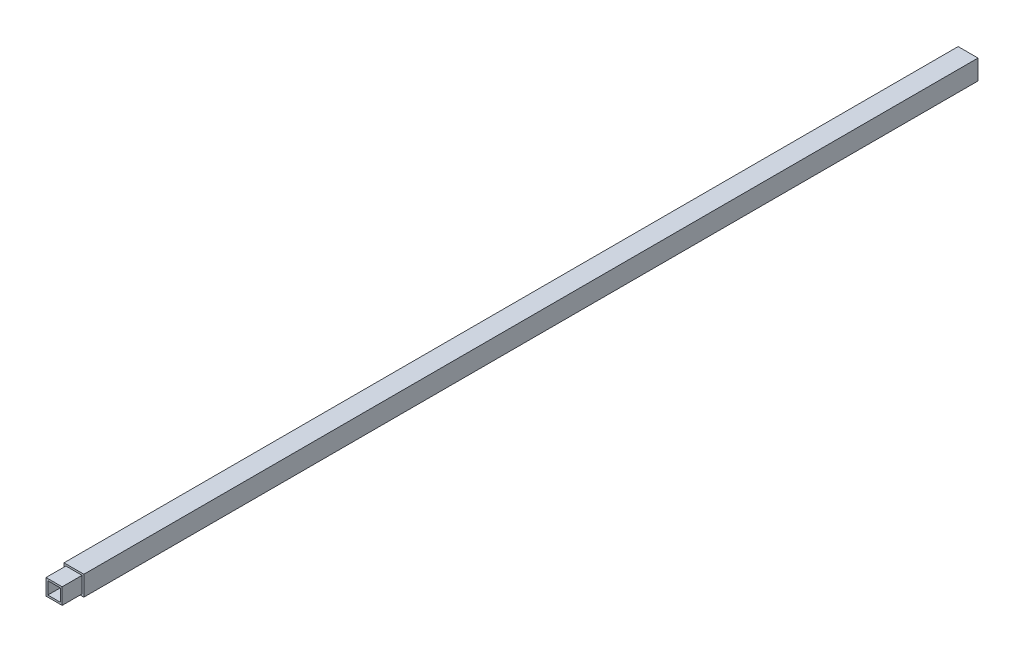
ISO-10303-21;
HEADER;
FILE_DESCRIPTION(('STEP AP214'),'2;1');
FILE_NAME('part.step','',(''),(''),'','','');
FILE_SCHEMA(('AUTOMOTIVE_DESIGN { 1 0 10303 214 1 1 1 1 }'));
ENDSEC;
DATA;
#1=APPLICATION_CONTEXT('core data for automotive mechanical design processes');
#2=APPLICATION_PROTOCOL_DEFINITION('international standard','automotive_design',2000,#1);
#3=PRODUCT_CONTEXT('',#1,'mechanical');
#4=PRODUCT('Part','Part','',(#3));
#5=PRODUCT_RELATED_PRODUCT_CATEGORY('part','',(#4));
#6=PRODUCT_DEFINITION_FORMATION('','',#4);
#7=PRODUCT_DEFINITION_CONTEXT('part definition',#1,'design');
#8=PRODUCT_DEFINITION('design','',#6,#7);
#9=PRODUCT_DEFINITION_SHAPE('','',#8);
#10=(LENGTH_UNIT() NAMED_UNIT(*) SI_UNIT(.MILLI.,.METRE.));
#11=(NAMED_UNIT(*) PLANE_ANGLE_UNIT() SI_UNIT($,.RADIAN.));
#12=(NAMED_UNIT(*) SI_UNIT($,.STERADIAN.) SOLID_ANGLE_UNIT());
#13=UNCERTAINTY_MEASURE_WITH_UNIT(LENGTH_MEASURE(1.E-05),#10,'distance_accuracy_value','');
#14=(GEOMETRIC_REPRESENTATION_CONTEXT(3) GLOBAL_UNCERTAINTY_ASSIGNED_CONTEXT((#13)) GLOBAL_UNIT_ASSIGNED_CONTEXT((#10,
#11,#12)) REPRESENTATION_CONTEXT('',''));
#15=CARTESIAN_POINT('',(0.,0.,0.));
#16=DIRECTION('',(0.,0.,1.));
#17=DIRECTION('',(1.,0.,0.));
#18=AXIS2_PLACEMENT_3D('',#15,#16,#17);
#19=CARTESIAN_POINT('',(0.,4.7625,1143.));
#20=DIRECTION('',(0.,1.,0.));
#21=DIRECTION('',(0.,0.,1.));
#22=AXIS2_PLACEMENT_3D('',#19,#20,#21);
#23=PLANE('',#22);
#24=DIRECTION('',(0.,0.,-1.));
#25=VECTOR('',#24,1.);
#26=CARTESIAN_POINT('',(4.7625,4.7625,1143.));
#27=LINE('',#26,#25);
#28=CARTESIAN_POINT('',(4.7625,4.7625,1092.2));
#29=VERTEX_POINT('',#28);
#30=CARTESIAN_POINT('',(4.7625,4.7625,-1143.));
#31=VERTEX_POINT('',#30);
#32=EDGE_CURVE('E11',#29,#31,#27,.T.);
#33=ORIENTED_EDGE('',*,*,#32,.F.);
#34=DIRECTION('',(1.,0.,0.));
#35=VECTOR('',#34,1.);
#36=CARTESIAN_POINT('',(0.,4.7625,1092.2));
#37=LINE('',#36,#35);
#38=CARTESIAN_POINT('',(46.0374560000001,4.7625,1092.2));
#39=VERTEX_POINT('',#38);
#40=EDGE_CURVE('E203',#29,#39,#37,.T.);
#41=ORIENTED_EDGE('',*,*,#40,.T.);
#42=DIRECTION('',(0.,0.,-1.));
#43=VECTOR('',#42,1.);
#44=CARTESIAN_POINT('',(46.0374560000001,4.7625,1143.));
#45=LINE('',#44,#43);
#46=CARTESIAN_POINT('',(46.0374560000001,4.7625,-1143.));
#47=VERTEX_POINT('',#46);
#48=EDGE_CURVE('E268',#39,#47,#45,.T.);
#49=ORIENTED_EDGE('',*,*,#48,.T.);
#50=DIRECTION('',(1.,0.,0.));
#51=VECTOR('',#50,1.);
#52=CARTESIAN_POINT('',(0.,4.7625,-1143.));
#53=LINE('',#52,#51);
#54=EDGE_CURVE('E257',#31,#47,#53,.T.);
#55=ORIENTED_EDGE('',*,*,#54,.F.);
#56=EDGE_LOOP('',(#33,#41,#49,#55));
#57=FACE_BOUND('',#56,.T.);
#58=ADVANCED_FACE('F35',(#57),#23,.T.);
#59=CARTESIAN_POINT('',(4.7625,0.,1143.));
#60=DIRECTION('',(-1.,0.,0.));
#61=DIRECTION('',(0.,0.,1.));
#62=AXIS2_PLACEMENT_3D('',#59,#60,#61);
#63=PLANE('',#62);
#64=DIRECTION('',(0.,1.,0.));
#65=VECTOR('',#64,1.);
#66=CARTESIAN_POINT('',(4.7625,0.,1092.2));
#67=LINE('',#66,#65);
#68=CARTESIAN_POINT('',(4.7625,46.037456,1092.2));
#69=VERTEX_POINT('',#68);
#70=EDGE_CURVE('E51',#29,#69,#67,.T.);
#71=ORIENTED_EDGE('',*,*,#70,.F.);
#72=ORIENTED_EDGE('',*,*,#32,.T.);
#73=DIRECTION('',(0.,1.,0.));
#74=VECTOR('',#73,1.);
#75=CARTESIAN_POINT('',(4.7625,0.,-1143.));
#76=LINE('',#75,#74);
#77=CARTESIAN_POINT('',(4.7625,46.037456,-1143.));
#78=VERTEX_POINT('',#77);
#79=EDGE_CURVE('E260',#31,#78,#76,.T.);
#80=ORIENTED_EDGE('',*,*,#79,.T.);
#81=DIRECTION('',(0.,0.,-1.));
#82=VECTOR('',#81,1.);
#83=CARTESIAN_POINT('',(4.7625,46.037456,1143.));
#84=LINE('',#83,#82);
#85=EDGE_CURVE('E44',#69,#78,#84,.T.);
#86=ORIENTED_EDGE('',*,*,#85,.F.);
#87=EDGE_LOOP('',(#71,#72,#80,#86));
#88=FACE_BOUND('',#87,.T.);
#89=ADVANCED_FACE('F327',(#88),#63,.F.);
#90=CARTESIAN_POINT('',(0.,46.037456,1143.));
#91=DIRECTION('',(0.,-1.,0.));
#92=DIRECTION('',(1.,0.,0.));
#93=AXIS2_PLACEMENT_3D('',#90,#91,#92);
#94=PLANE('',#93);
#95=DIRECTION('',(0.,0.,-1.));
#96=VECTOR('',#95,1.);
#97=CARTESIAN_POINT('',(46.037456,46.037456,1143.));
#98=LINE('',#97,#96);
#99=CARTESIAN_POINT('',(46.037456,46.037456,1092.2));
#100=VERTEX_POINT('',#99);
#101=CARTESIAN_POINT('',(46.037456,46.037456,-1143.));
#102=VERTEX_POINT('',#101);
#103=EDGE_CURVE('E270',#100,#102,#98,.T.);
#104=ORIENTED_EDGE('',*,*,#103,.F.);
#105=DIRECTION('',(-1.,0.,0.));
#106=VECTOR('',#105,1.);
#107=CARTESIAN_POINT('',(0.,46.037456,1092.2));
#108=LINE('',#107,#106);
#109=EDGE_CURVE('E59',#100,#69,#108,.T.);
#110=ORIENTED_EDGE('',*,*,#109,.T.);
#111=ORIENTED_EDGE('',*,*,#85,.T.);
#112=DIRECTION('',(-1.,0.,0.));
#113=VECTOR('',#112,1.);
#114=CARTESIAN_POINT('',(0.,46.037456,-1143.));
#115=LINE('',#114,#113);
#116=EDGE_CURVE('E263',#102,#78,#115,.T.);
#117=ORIENTED_EDGE('',*,*,#116,.F.);
#118=EDGE_LOOP('',(#104,#110,#111,#117));
#119=FACE_BOUND('',#118,.T.);
#120=ADVANCED_FACE('F333',(#119),#94,.T.);
#121=CARTESIAN_POINT('',(46.0374560000001,0.,1143.));
#122=DIRECTION('',(1.,0.,0.));
#123=DIRECTION('',(0.,1.,0.));
#124=AXIS2_PLACEMENT_3D('',#121,#122,#123);
#125=PLANE('',#124);
#126=DIRECTION('',(0.,-1.,0.));
#127=VECTOR('',#126,1.);
#128=CARTESIAN_POINT('',(46.0374560000001,0.,1092.2));
#129=LINE('',#128,#127);
#130=EDGE_CURVE('E177',#100,#39,#129,.T.);
#131=ORIENTED_EDGE('',*,*,#130,.F.);
#132=ORIENTED_EDGE('',*,*,#103,.T.);
#133=DIRECTION('',(0.,-1.,0.));
#134=VECTOR('',#133,1.);
#135=CARTESIAN_POINT('',(46.0374560000001,0.,-1143.));
#136=LINE('',#135,#134);
#137=EDGE_CURVE('E228',#102,#47,#136,.T.);
#138=ORIENTED_EDGE('',*,*,#137,.T.);
#139=ORIENTED_EDGE('',*,*,#48,.F.);
#140=EDGE_LOOP('',(#131,#132,#138,#139));
#141=FACE_BOUND('',#140,.T.);
#142=ADVANCED_FACE('F344',(#141),#125,.F.);
#143=CARTESIAN_POINT('',(50.7999560000001,0.,1143.));
#144=DIRECTION('',(1.,0.,0.));
#145=DIRECTION('',(0.,1.,0.));
#146=AXIS2_PLACEMENT_3D('',#143,#144,#145);
#147=PLANE('',#146);
#148=DIRECTION('',(0.,-1.,0.));
#149=VECTOR('',#148,1.);
#150=CARTESIAN_POINT('',(50.7999560000001,0.,-1143.));
#151=LINE('',#150,#149);
#152=CARTESIAN_POINT('',(50.799956,50.799956,-1143.));
#153=VERTEX_POINT('',#152);
#154=CARTESIAN_POINT('',(50.7999560000001,0.,-1143.));
#155=VERTEX_POINT('',#154);
#156=EDGE_CURVE('E219',#153,#155,#151,.T.);
#157=ORIENTED_EDGE('',*,*,#156,.F.);
#158=DIRECTION('',(0.,0.,-1.));
#159=VECTOR('',#158,1.);
#160=CARTESIAN_POINT('',(50.799956,50.799956,1143.));
#161=LINE('',#160,#159);
#162=CARTESIAN_POINT('',(50.799956,50.799956,1143.));
#163=VERTEX_POINT('',#162);
#164=EDGE_CURVE('E39',#163,#153,#161,.T.);
#165=ORIENTED_EDGE('',*,*,#164,.F.);
#166=DIRECTION('',(0.,-1.,0.));
#167=VECTOR('',#166,1.);
#168=CARTESIAN_POINT('',(50.7999560000001,0.,1143.));
#169=LINE('',#168,#167);
#170=CARTESIAN_POINT('',(50.7999560000001,0.,1143.));
#171=VERTEX_POINT('',#170);
#172=EDGE_CURVE('E224',#163,#171,#169,.T.);
#173=ORIENTED_EDGE('',*,*,#172,.T.);
#174=DIRECTION('',(0.,0.,-1.));
#175=VECTOR('',#174,1.);
#176=CARTESIAN_POINT('',(50.7999560000001,0.,1143.));
#177=LINE('',#176,#175);
#178=EDGE_CURVE('E245',#171,#155,#177,.T.);
#179=ORIENTED_EDGE('',*,*,#178,.T.);
#180=EDGE_LOOP('',(#157,#165,#173,#179));
#181=FACE_BOUND('',#180,.T.);
#182=ADVANCED_FACE('F37',(#181),#147,.T.);
#183=CARTESIAN_POINT('',(0.,50.799956,1143.));
#184=DIRECTION('',(0.,-1.,0.));
#185=DIRECTION('',(1.,0.,0.));
#186=AXIS2_PLACEMENT_3D('',#183,#184,#185);
#187=PLANE('',#186);
#188=DIRECTION('',(-1.,0.,0.));
#189=VECTOR('',#188,1.);
#190=CARTESIAN_POINT('',(0.,50.799956,-1143.));
#191=LINE('',#190,#189);
#192=CARTESIAN_POINT('',(0.,50.799956,-1143.));
#193=VERTEX_POINT('',#192);
#194=EDGE_CURVE('E248',#153,#193,#191,.T.);
#195=ORIENTED_EDGE('',*,*,#194,.T.);
#196=DIRECTION('',(0.,0.,-1.));
#197=VECTOR('',#196,1.);
#198=CARTESIAN_POINT('',(0.,50.799956,1143.));
#199=LINE('',#198,#197);
#200=CARTESIAN_POINT('',(0.,50.799956,1143.));
#201=VERTEX_POINT('',#200);
#202=EDGE_CURVE('E275',#201,#193,#199,.T.);
#203=ORIENTED_EDGE('',*,*,#202,.F.);
#204=DIRECTION('',(-1.,0.,0.));
#205=VECTOR('',#204,1.);
#206=CARTESIAN_POINT('',(0.,50.799956,1143.));
#207=LINE('',#206,#205);
#208=EDGE_CURVE('E227',#163,#201,#207,.T.);
#209=ORIENTED_EDGE('',*,*,#208,.F.);
#210=ORIENTED_EDGE('',*,*,#164,.T.);
#211=EDGE_LOOP('',(#195,#203,#209,#210));
#212=FACE_BOUND('',#211,.T.);
#213=ADVANCED_FACE('F282',(#212),#187,.F.);
#214=CARTESIAN_POINT('',(0.,0.,1143.));
#215=DIRECTION('',(-1.,0.,0.));
#216=DIRECTION('',(0.,0.,1.));
#217=AXIS2_PLACEMENT_3D('',#214,#215,#216);
#218=PLANE('',#217);
#219=DIRECTION('',(0.,1.,0.));
#220=VECTOR('',#219,1.);
#221=CARTESIAN_POINT('',(0.,0.,-1143.));
#222=LINE('',#221,#220);
#223=CARTESIAN_POINT('',(0.,0.,-1143.));
#224=VERTEX_POINT('',#223);
#225=EDGE_CURVE('E251',#224,#193,#222,.T.);
#226=ORIENTED_EDGE('',*,*,#225,.F.);
#227=DIRECTION('',(0.,0.,-1.));
#228=VECTOR('',#227,1.);
#229=CARTESIAN_POINT('',(0.,0.,1143.));
#230=LINE('',#229,#228);
#231=CARTESIAN_POINT('',(0.,0.,1143.));
#232=VERTEX_POINT('',#231);
#233=EDGE_CURVE('E274',#232,#224,#230,.T.);
#234=ORIENTED_EDGE('',*,*,#233,.F.);
#235=DIRECTION('',(0.,1.,0.));
#236=VECTOR('',#235,1.);
#237=CARTESIAN_POINT('',(0.,0.,1143.));
#238=LINE('',#237,#236);
#239=EDGE_CURVE('E230',#232,#201,#238,.T.);
#240=ORIENTED_EDGE('',*,*,#239,.T.);
#241=ORIENTED_EDGE('',*,*,#202,.T.);
#242=EDGE_LOOP('',(#226,#234,#240,#241));
#243=FACE_BOUND('',#242,.T.);
#244=ADVANCED_FACE('F294',(#243),#218,.T.);
#245=CARTESIAN_POINT('',(0.,0.,1143.));
#246=DIRECTION('',(0.,1.,0.));
#247=DIRECTION('',(0.,0.,1.));
#248=AXIS2_PLACEMENT_3D('',#245,#246,#247);
#249=PLANE('',#248);
#250=DIRECTION('',(1.,0.,0.));
#251=VECTOR('',#250,1.);
#252=CARTESIAN_POINT('',(0.,0.,-1143.));
#253=LINE('',#252,#251);
#254=EDGE_CURVE('E254',#224,#155,#253,.T.);
#255=ORIENTED_EDGE('',*,*,#254,.T.);
#256=ORIENTED_EDGE('',*,*,#178,.F.);
#257=DIRECTION('',(1.,0.,0.));
#258=VECTOR('',#257,1.);
#259=CARTESIAN_POINT('',(0.,0.,1143.));
#260=LINE('',#259,#258);
#261=EDGE_CURVE('E233',#232,#171,#260,.T.);
#262=ORIENTED_EDGE('',*,*,#261,.F.);
#263=ORIENTED_EDGE('',*,*,#233,.T.);
#264=EDGE_LOOP('',(#255,#256,#262,#263));
#265=FACE_BOUND('',#264,.T.);
#266=ADVANCED_FACE('F293',(#265),#249,.F.);
#267=CARTESIAN_POINT('',(0.,0.,1143.));
#268=DIRECTION('',(0.,0.,1.));
#269=DIRECTION('',(1.,0.,0.));
#270=AXIS2_PLACEMENT_3D('',#267,#268,#269);
#271=PLANE('',#270);
#272=ORIENTED_EDGE('',*,*,#172,.F.);
#273=ORIENTED_EDGE('',*,*,#208,.T.);
#274=ORIENTED_EDGE('',*,*,#239,.F.);
#275=ORIENTED_EDGE('',*,*,#261,.T.);
#276=EDGE_LOOP('',(#272,#273,#274,#275));
#277=FACE_BOUND('',#276,.T.);
#278=DIRECTION('',(1.,0.,0.));
#279=VECTOR('',#278,1.);
#280=CARTESIAN_POINT('',(0.,4.7625,1143.));
#281=LINE('',#280,#279);
#282=CARTESIAN_POINT('',(4.7625,4.7625,1143.));
#283=VERTEX_POINT('',#282);
#284=CARTESIAN_POINT('',(46.0374560000001,4.7625,1143.));
#285=VERTEX_POINT('',#284);
#286=EDGE_CURVE('E235',#283,#285,#281,.T.);
#287=ORIENTED_EDGE('',*,*,#286,.F.);
#288=DIRECTION('',(0.,1.,0.));
#289=VECTOR('',#288,1.);
#290=CARTESIAN_POINT('',(4.7625,0.,1143.));
#291=LINE('',#290,#289);
#292=CARTESIAN_POINT('',(4.7625,46.037456,1143.));
#293=VERTEX_POINT('',#292);
#294=EDGE_CURVE('E238',#283,#293,#291,.T.);
#295=ORIENTED_EDGE('',*,*,#294,.T.);
#296=DIRECTION('',(-1.,0.,0.));
#297=VECTOR('',#296,1.);
#298=CARTESIAN_POINT('',(0.,46.037456,1143.));
#299=LINE('',#298,#297);
#300=CARTESIAN_POINT('',(46.037456,46.037456,1143.));
#301=VERTEX_POINT('',#300);
#302=EDGE_CURVE('E240',#301,#293,#299,.T.);
#303=ORIENTED_EDGE('',*,*,#302,.F.);
#304=DIRECTION('',(0.,-1.,0.));
#305=VECTOR('',#304,1.);
#306=CARTESIAN_POINT('',(46.0374560000001,0.,1143.));
#307=LINE('',#306,#305);
#308=EDGE_CURVE('E243',#301,#285,#307,.T.);
#309=ORIENTED_EDGE('',*,*,#308,.T.);
#310=EDGE_LOOP('',(#287,#295,#303,#309));
#311=FACE_BOUND('',#310,.T.);
#312=ADVANCED_FACE('F297',(#277,#311),#271,.T.);
#313=CARTESIAN_POINT('',(0.,0.,-1143.));
#314=DIRECTION('',(0.,0.,1.));
#315=DIRECTION('',(1.,0.,0.));
#316=AXIS2_PLACEMENT_3D('',#313,#314,#315);
#317=PLANE('',#316);
#318=ORIENTED_EDGE('',*,*,#156,.T.);
#319=ORIENTED_EDGE('',*,*,#254,.F.);
#320=ORIENTED_EDGE('',*,*,#225,.T.);
#321=ORIENTED_EDGE('',*,*,#194,.F.);
#322=EDGE_LOOP('',(#318,#319,#320,#321));
#323=FACE_BOUND('',#322,.T.);
#324=ORIENTED_EDGE('',*,*,#54,.T.);
#325=ORIENTED_EDGE('',*,*,#137,.F.);
#326=ORIENTED_EDGE('',*,*,#116,.T.);
#327=ORIENTED_EDGE('',*,*,#79,.F.);
#328=EDGE_LOOP('',(#324,#325,#326,#327));
#329=FACE_BOUND('',#328,.T.);
#330=ADVANCED_FACE('F287',(#323,#329),#317,.F.);
#331=CARTESIAN_POINT('',(4.7625,0.,1193.8));
#332=DIRECTION('',(-1.,0.,0.));
#333=DIRECTION('',(0.,0.,1.));
#334=AXIS2_PLACEMENT_3D('',#331,#332,#333);
#335=PLANE('',#334);
#336=DIRECTION('',(0.,0.,-1.));
#337=VECTOR('',#336,1.);
#338=CARTESIAN_POINT('',(4.7625,46.037456,1193.8));
#339=LINE('',#338,#337);
#340=CARTESIAN_POINT('',(4.7625,46.037456,1193.8));
#341=VERTEX_POINT('',#340);
#342=EDGE_CURVE('E160',#341,#293,#339,.T.);
#343=ORIENTED_EDGE('',*,*,#342,.T.);
#344=ORIENTED_EDGE('',*,*,#294,.F.);
#345=DIRECTION('',(0.,0.,-1.));
#346=VECTOR('',#345,1.);
#347=CARTESIAN_POINT('',(4.7625,4.7625,1193.8));
#348=LINE('',#347,#346);
#349=CARTESIAN_POINT('',(4.7625,4.7625,1193.8));
#350=VERTEX_POINT('',#349);
#351=EDGE_CURVE('E216',#350,#283,#348,.T.);
#352=ORIENTED_EDGE('',*,*,#351,.F.);
#353=DIRECTION('',(0.,1.,0.));
#354=VECTOR('',#353,1.);
#355=CARTESIAN_POINT('',(4.7625,0.,1193.8));
#356=LINE('',#355,#354);
#357=EDGE_CURVE('E182',#350,#341,#356,.T.);
#358=ORIENTED_EDGE('',*,*,#357,.T.);
#359=EDGE_LOOP('',(#343,#344,#352,#358));
#360=FACE_BOUND('',#359,.T.);
#361=ADVANCED_FACE('F306',(#360),#335,.T.);
#362=CARTESIAN_POINT('',(0.,4.7625,1193.8));
#363=DIRECTION('',(0.,1.,0.));
#364=DIRECTION('',(0.,0.,1.));
#365=AXIS2_PLACEMENT_3D('',#362,#363,#364);
#366=PLANE('',#365);
#367=ORIENTED_EDGE('',*,*,#286,.T.);
#368=DIRECTION('',(0.,0.,-1.));
#369=VECTOR('',#368,1.);
#370=CARTESIAN_POINT('',(46.0374560000001,4.7625,1193.8));
#371=LINE('',#370,#369);
#372=CARTESIAN_POINT('',(46.0374560000001,4.7625,1193.8));
#373=VERTEX_POINT('',#372);
#374=EDGE_CURVE('E213',#373,#285,#371,.T.);
#375=ORIENTED_EDGE('',*,*,#374,.F.);
#376=DIRECTION('',(1.,0.,0.));
#377=VECTOR('',#376,1.);
#378=CARTESIAN_POINT('',(0.,4.7625,1193.8));
#379=LINE('',#378,#377);
#380=EDGE_CURVE('E185',#350,#373,#379,.T.);
#381=ORIENTED_EDGE('',*,*,#380,.F.);
#382=ORIENTED_EDGE('',*,*,#351,.T.);
#383=EDGE_LOOP('',(#367,#375,#381,#382));
#384=FACE_BOUND('',#383,.T.);
#385=ADVANCED_FACE('F309',(#384),#366,.F.);
#386=CARTESIAN_POINT('',(46.0374560000001,0.,1193.8));
#387=DIRECTION('',(1.,0.,0.));
#388=DIRECTION('',(0.,1.,0.));
#389=AXIS2_PLACEMENT_3D('',#386,#387,#388);
#390=PLANE('',#389);
#391=ORIENTED_EDGE('',*,*,#374,.T.);
#392=ORIENTED_EDGE('',*,*,#308,.F.);
#393=DIRECTION('',(0.,0.,-1.));
#394=VECTOR('',#393,1.);
#395=CARTESIAN_POINT('',(46.037456,46.037456,1193.8));
#396=LINE('',#395,#394);
#397=CARTESIAN_POINT('',(46.037456,46.037456,1193.8));
#398=VERTEX_POINT('',#397);
#399=EDGE_CURVE('E210',#398,#301,#396,.T.);
#400=ORIENTED_EDGE('',*,*,#399,.F.);
#401=DIRECTION('',(0.,-1.,0.));
#402=VECTOR('',#401,1.);
#403=CARTESIAN_POINT('',(46.0374560000001,0.,1193.8));
#404=LINE('',#403,#402);
#405=EDGE_CURVE('E187',#398,#373,#404,.T.);
#406=ORIENTED_EDGE('',*,*,#405,.T.);
#407=EDGE_LOOP('',(#391,#392,#400,#406));
#408=FACE_BOUND('',#407,.T.);
#409=ADVANCED_FACE('F316',(#408),#390,.T.);
#410=CARTESIAN_POINT('',(0.,9.525,1193.8));
#411=DIRECTION('',(0.,1.,0.));
#412=DIRECTION('',(0.,0.,1.));
#413=AXIS2_PLACEMENT_3D('',#410,#411,#412);
#414=PLANE('',#413);
#415=DIRECTION('',(1.,0.,0.));
#416=VECTOR('',#415,1.);
#417=CARTESIAN_POINT('',(0.,9.525,1092.2));
#418=LINE('',#417,#416);
#419=CARTESIAN_POINT('',(9.525,9.525,1092.2));
#420=VERTEX_POINT('',#419);
#421=CARTESIAN_POINT('',(41.274956,9.525,1092.2));
#422=VERTEX_POINT('',#421);
#423=EDGE_CURVE('E156',#420,#422,#418,.T.);
#424=ORIENTED_EDGE('',*,*,#423,.F.);
#425=DIRECTION('',(0.,0.,-1.));
#426=VECTOR('',#425,1.);
#427=CARTESIAN_POINT('',(9.525,9.525,1193.8));
#428=LINE('',#427,#426);
#429=CARTESIAN_POINT('',(9.525,9.525,1193.8));
#430=VERTEX_POINT('',#429);
#431=EDGE_CURVE('E150',#430,#420,#428,.T.);
#432=ORIENTED_EDGE('',*,*,#431,.F.);
#433=DIRECTION('',(1.,0.,0.));
#434=VECTOR('',#433,1.);
#435=CARTESIAN_POINT('',(0.,9.525,1193.8));
#436=LINE('',#435,#434);
#437=CARTESIAN_POINT('',(41.274956,9.525,1193.8));
#438=VERTEX_POINT('',#437);
#439=EDGE_CURVE('E154',#430,#438,#436,.T.);
#440=ORIENTED_EDGE('',*,*,#439,.T.);
#441=DIRECTION('',(0.,0.,-1.));
#442=VECTOR('',#441,1.);
#443=CARTESIAN_POINT('',(41.274956,9.525,1193.8));
#444=LINE('',#443,#442);
#445=EDGE_CURVE('E192',#438,#422,#444,.T.);
#446=ORIENTED_EDGE('',*,*,#445,.T.);
#447=EDGE_LOOP('',(#424,#432,#440,#446));
#448=FACE_BOUND('',#447,.T.);
#449=ADVANCED_FACE('F152',(#448),#414,.T.);
#450=CARTESIAN_POINT('',(9.525,0.,1193.8));
#451=DIRECTION('',(-1.,0.,0.));
#452=DIRECTION('',(0.,-1.,0.));
#453=AXIS2_PLACEMENT_3D('',#450,#451,#452);
#454=PLANE('',#453);
#455=DIRECTION('',(0.,1.,0.));
#456=VECTOR('',#455,1.);
#457=CARTESIAN_POINT('',(9.525,0.,1092.2));
#458=LINE('',#457,#456);
#459=CARTESIAN_POINT('',(9.525,41.274956,1092.2));
#460=VERTEX_POINT('',#459);
#461=EDGE_CURVE('E194',#420,#460,#458,.T.);
#462=ORIENTED_EDGE('',*,*,#461,.T.);
#463=DIRECTION('',(0.,0.,-1.));
#464=VECTOR('',#463,1.);
#465=CARTESIAN_POINT('',(9.525,41.274956,1193.8));
#466=LINE('',#465,#464);
#467=CARTESIAN_POINT('',(9.525,41.274956,1193.8));
#468=VERTEX_POINT('',#467);
#469=EDGE_CURVE('E161',#468,#460,#466,.T.);
#470=ORIENTED_EDGE('',*,*,#469,.F.);
#471=DIRECTION('',(0.,1.,0.));
#472=VECTOR('',#471,1.);
#473=CARTESIAN_POINT('',(9.525,0.,1193.8));
#474=LINE('',#473,#472);
#475=EDGE_CURVE('E164',#430,#468,#474,.T.);
#476=ORIENTED_EDGE('',*,*,#475,.F.);
#477=ORIENTED_EDGE('',*,*,#431,.T.);
#478=EDGE_LOOP('',(#462,#470,#476,#477));
#479=FACE_BOUND('',#478,.T.);
#480=ADVANCED_FACE('F165',(#479),#454,.F.);
#481=CARTESIAN_POINT('',(0.,41.274956,1193.8));
#482=DIRECTION('',(0.,-1.,0.));
#483=DIRECTION('',(0.,0.,-1.));
#484=AXIS2_PLACEMENT_3D('',#481,#482,#483);
#485=PLANE('',#484);
#486=DIRECTION('',(-1.,0.,0.));
#487=VECTOR('',#486,1.);
#488=CARTESIAN_POINT('',(0.,41.274956,1092.2));
#489=LINE('',#488,#487);
#490=CARTESIAN_POINT('',(41.274956,41.274956,1092.2));
#491=VERTEX_POINT('',#490);
#492=EDGE_CURVE('E196',#491,#460,#489,.T.);
#493=ORIENTED_EDGE('',*,*,#492,.F.);
#494=DIRECTION('',(0.,0.,-1.));
#495=VECTOR('',#494,1.);
#496=CARTESIAN_POINT('',(41.274956,41.274956,1193.8));
#497=LINE('',#496,#495);
#498=CARTESIAN_POINT('',(41.274956,41.274956,1193.8));
#499=VERTEX_POINT('',#498);
#500=EDGE_CURVE('E221',#499,#491,#497,.T.);
#501=ORIENTED_EDGE('',*,*,#500,.F.);
#502=DIRECTION('',(-1.,0.,0.));
#503=VECTOR('',#502,1.);
#504=CARTESIAN_POINT('',(0.,41.274956,1193.8));
#505=LINE('',#504,#503);
#506=EDGE_CURVE('E169',#499,#468,#505,.T.);
#507=ORIENTED_EDGE('',*,*,#506,.T.);
#508=ORIENTED_EDGE('',*,*,#469,.T.);
#509=EDGE_LOOP('',(#493,#501,#507,#508));
#510=FACE_BOUND('',#509,.T.);
#511=ADVANCED_FACE('F358',(#510),#485,.T.);
#512=CARTESIAN_POINT('',(41.274956,0.,1193.8));
#513=DIRECTION('',(1.,0.,0.));
#514=DIRECTION('',(0.,0.,-1.));
#515=AXIS2_PLACEMENT_3D('',#512,#513,#514);
#516=PLANE('',#515);
#517=DIRECTION('',(0.,-1.,0.));
#518=VECTOR('',#517,1.);
#519=CARTESIAN_POINT('',(41.274956,0.,1092.2));
#520=LINE('',#519,#518);
#521=EDGE_CURVE('E199',#491,#422,#520,.T.);
#522=ORIENTED_EDGE('',*,*,#521,.T.);
#523=ORIENTED_EDGE('',*,*,#445,.F.);
#524=DIRECTION('',(0.,-1.,0.));
#525=VECTOR('',#524,1.);
#526=CARTESIAN_POINT('',(41.274956,0.,1193.8));
#527=LINE('',#526,#525);
#528=EDGE_CURVE('E174',#499,#438,#527,.T.);
#529=ORIENTED_EDGE('',*,*,#528,.F.);
#530=ORIENTED_EDGE('',*,*,#500,.T.);
#531=EDGE_LOOP('',(#522,#523,#529,#530));
#532=FACE_BOUND('',#531,.T.);
#533=ADVANCED_FACE('F361',(#532),#516,.F.);
#534=CARTESIAN_POINT('',(0.,46.037456,1193.8));
#535=DIRECTION('',(0.,-1.,0.));
#536=DIRECTION('',(1.,0.,0.));
#537=AXIS2_PLACEMENT_3D('',#534,#535,#536);
#538=PLANE('',#537);
#539=ORIENTED_EDGE('',*,*,#302,.T.);
#540=ORIENTED_EDGE('',*,*,#342,.F.);
#541=DIRECTION('',(-1.,0.,0.));
#542=VECTOR('',#541,1.);
#543=CARTESIAN_POINT('',(0.,46.037456,1193.8));
#544=LINE('',#543,#542);
#545=EDGE_CURVE('E190',#398,#341,#544,.T.);
#546=ORIENTED_EDGE('',*,*,#545,.F.);
#547=ORIENTED_EDGE('',*,*,#399,.T.);
#548=EDGE_LOOP('',(#539,#540,#546,#547));
#549=FACE_BOUND('',#548,.T.);
#550=ADVANCED_FACE('F314',(#549),#538,.F.);
#551=CARTESIAN_POINT('',(0.,0.,1193.8));
#552=DIRECTION('',(0.,0.,1.));
#553=DIRECTION('',(1.,0.,0.));
#554=AXIS2_PLACEMENT_3D('',#551,#552,#553);
#555=PLANE('',#554);
#556=ORIENTED_EDGE('',*,*,#439,.F.);
#557=ORIENTED_EDGE('',*,*,#475,.T.);
#558=ORIENTED_EDGE('',*,*,#506,.F.);
#559=ORIENTED_EDGE('',*,*,#528,.T.);
#560=EDGE_LOOP('',(#556,#557,#558,#559));
#561=FACE_BOUND('',#560,.T.);
#562=ORIENTED_EDGE('',*,*,#357,.F.);
#563=ORIENTED_EDGE('',*,*,#380,.T.);
#564=ORIENTED_EDGE('',*,*,#405,.F.);
#565=ORIENTED_EDGE('',*,*,#545,.T.);
#566=EDGE_LOOP('',(#562,#563,#564,#565));
#567=FACE_BOUND('',#566,.T.);
#568=ADVANCED_FACE('F171',(#561,#567),#555,.T.);
#569=CARTESIAN_POINT('',(0.,0.,1092.2));
#570=DIRECTION('',(0.,0.,1.));
#571=DIRECTION('',(1.,0.,0.));
#572=AXIS2_PLACEMENT_3D('',#569,#570,#571);
#573=PLANE('',#572);
#574=ORIENTED_EDGE('',*,*,#423,.T.);
#575=ORIENTED_EDGE('',*,*,#521,.F.);
#576=ORIENTED_EDGE('',*,*,#492,.T.);
#577=ORIENTED_EDGE('',*,*,#461,.F.);
#578=EDGE_LOOP('',(#574,#575,#576,#577));
#579=FACE_BOUND('',#578,.T.);
#580=ORIENTED_EDGE('',*,*,#70,.T.);
#581=ORIENTED_EDGE('',*,*,#109,.F.);
#582=ORIENTED_EDGE('',*,*,#130,.T.);
#583=ORIENTED_EDGE('',*,*,#40,.F.);
#584=EDGE_LOOP('',(#580,#581,#582,#583));
#585=FACE_BOUND('',#584,.T.);
#586=ADVANCED_FACE('F420',(#579,#585),#573,.F.);
#587=CLOSED_SHELL('',(#58,#89,#120,#142,#182,#213,#244,#266,#312,#330,#361,#385,#409,#449,#480,
#511,#533,#550,#568,#586));
#588=MANIFOLD_SOLID_BREP('B2',#587);
#589=ADVANCED_BREP_SHAPE_REPRESENTATION('',(#18,#588),#14);
#590=SHAPE_DEFINITION_REPRESENTATION(#9,#589);
ENDSEC;
END-ISO-10303-21;
